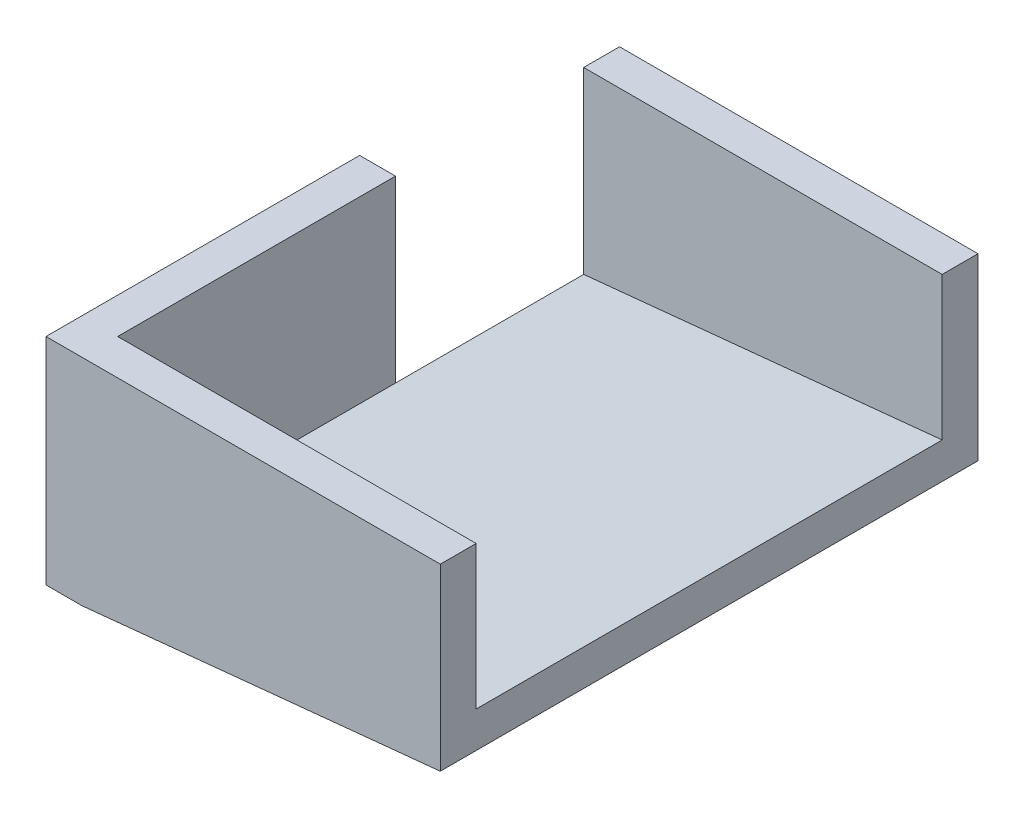
ISO-10303-21;
HEADER;
FILE_DESCRIPTION(('STEP AP214'),'2;1');
FILE_NAME('part.step','',(''),(''),'','','');
FILE_SCHEMA(('AUTOMOTIVE_DESIGN { 1 0 10303 214 1 1 1 1 }'));
ENDSEC;
DATA;
#1=APPLICATION_CONTEXT('core data for automotive mechanical design processes');
#2=APPLICATION_PROTOCOL_DEFINITION('international standard','automotive_design',2000,#1);
#3=PRODUCT_CONTEXT('',#1,'mechanical');
#4=PRODUCT('Part','Part','',(#3));
#5=PRODUCT_RELATED_PRODUCT_CATEGORY('part','',(#4));
#6=PRODUCT_DEFINITION_FORMATION('','',#4);
#7=PRODUCT_DEFINITION_CONTEXT('part definition',#1,'design');
#8=PRODUCT_DEFINITION('design','',#6,#7);
#9=PRODUCT_DEFINITION_SHAPE('','',#8);
#10=(LENGTH_UNIT() NAMED_UNIT(*) SI_UNIT(.MILLI.,.METRE.));
#11=(NAMED_UNIT(*) PLANE_ANGLE_UNIT() SI_UNIT($,.RADIAN.));
#12=(NAMED_UNIT(*) SI_UNIT($,.STERADIAN.) SOLID_ANGLE_UNIT());
#13=UNCERTAINTY_MEASURE_WITH_UNIT(LENGTH_MEASURE(1.E-05),#10,'distance_accuracy_value','');
#14=(GEOMETRIC_REPRESENTATION_CONTEXT(3) GLOBAL_UNCERTAINTY_ASSIGNED_CONTEXT((#13)) GLOBAL_UNIT_ASSIGNED_CONTEXT((#10,
#11,#12)) REPRESENTATION_CONTEXT('',''));
#15=CARTESIAN_POINT('',(0.,0.,0.));
#16=DIRECTION('',(0.,0.,1.));
#17=DIRECTION('',(1.,0.,0.));
#18=AXIS2_PLACEMENT_3D('',#15,#16,#17);
#19=CARTESIAN_POINT('',(-99.9999999999999,-10.,300.));
#20=DIRECTION('',(1.,0.,0.));
#21=DIRECTION('',(0.,0.,-1.));
#22=AXIS2_PLACEMENT_3D('',#19,#20,#21);
#23=PLANE('',#22);
#24=DIRECTION('',(0.,-1.,0.));
#25=VECTOR('',#24,1.);
#26=CARTESIAN_POINT('',(-99.9999999999999,-30.070032415397,125.));
#27=LINE('',#26,#25);
#28=CARTESIAN_POINT('',(-99.9999999999999,-10.,125.));
#29=VERTEX_POINT('',#28);
#30=CARTESIAN_POINT('',(-100.,-30.070032415397,125.));
#31=VERTEX_POINT('',#30);
#32=EDGE_CURVE('E139',#29,#31,#27,.T.);
#33=ORIENTED_EDGE('',*,*,#32,.F.);
#34=DIRECTION('',(0.,0.,-1.));
#35=VECTOR('',#34,1.);
#36=CARTESIAN_POINT('',(-99.9999999999999,-10.,300.));
#37=LINE('',#36,#35);
#38=CARTESIAN_POINT('',(-99.9999999999999,-10.,20.));
#39=VERTEX_POINT('',#38);
#40=EDGE_CURVE('E44',#29,#39,#37,.T.);
#41=ORIENTED_EDGE('',*,*,#40,.T.);
#42=DIRECTION('',(0.,-1.,0.));
#43=VECTOR('',#42,1.);
#44=CARTESIAN_POINT('',(-99.9999999999999,90.,20.));
#45=LINE('',#44,#43);
#46=CARTESIAN_POINT('',(-99.9999999999999,90.,20.));
#47=VERTEX_POINT('',#46);
#48=EDGE_CURVE('E194',#47,#39,#45,.T.);
#49=ORIENTED_EDGE('',*,*,#48,.F.);
#50=DIRECTION('',(0.,0.,1.));
#51=VECTOR('',#50,1.);
#52=CARTESIAN_POINT('',(-99.9999999999999,90.,20.));
#53=LINE('',#52,#51);
#54=CARTESIAN_POINT('',(-99.9999999999999,90.,0.));
#55=VERTEX_POINT('',#54);
#56=EDGE_CURVE('E180',#55,#47,#53,.T.);
#57=ORIENTED_EDGE('',*,*,#56,.F.);
#58=DIRECTION('',(0.,-1.,0.));
#59=VECTOR('',#58,1.);
#60=CARTESIAN_POINT('',(-99.9999999999999,-10.,0.));
#61=LINE('',#60,#59);
#62=CARTESIAN_POINT('',(-100.,-30.070032415397,0.));
#63=VERTEX_POINT('',#62);
#64=EDGE_CURVE('E200',#55,#63,#61,.T.);
#65=ORIENTED_EDGE('',*,*,#64,.T.);
#66=DIRECTION('',(0.,0.,-1.));
#67=VECTOR('',#66,1.);
#68=CARTESIAN_POINT('',(-100.,-30.070032415397,0.));
#69=LINE('',#68,#67);
#70=EDGE_CURVE('E159',#31,#63,#69,.T.);
#71=ORIENTED_EDGE('',*,*,#70,.F.);
#72=EDGE_LOOP('',(#33,#41,#49,#57,#65,#71));
#73=FACE_BOUND('',#72,.T.);
#74=ADVANCED_FACE('F36',(#73),#23,.F.);
#75=CARTESIAN_POINT('',(100.,90.,280.));
#76=DIRECTION('',(0.,0.,1.));
#77=DIRECTION('',(1.,0.,0.));
#78=AXIS2_PLACEMENT_3D('',#75,#76,#77);
#79=PLANE('',#78);
#80=DIRECTION('',(0.,-1.,0.));
#81=VECTOR('',#80,1.);
#82=CARTESIAN_POINT('',(-99.9999999999999,241.327459504216,280.));
#83=LINE('',#82,#81);
#84=CARTESIAN_POINT('',(-99.9999999999999,90.,280.));
#85=VERTEX_POINT('',#84);
#86=CARTESIAN_POINT('',(-99.9999999999999,-10.,280.));
#87=VERTEX_POINT('',#86);
#88=EDGE_CURVE('E147',#85,#87,#83,.T.);
#89=ORIENTED_EDGE('',*,*,#88,.F.);
#90=DIRECTION('',(-1.,0.,0.));
#91=VECTOR('',#90,1.);
#92=CARTESIAN_POINT('',(100.,90.,280.));
#93=LINE('',#92,#91);
#94=CARTESIAN_POINT('',(100.,90.,280.));
#95=VERTEX_POINT('',#94);
#96=EDGE_CURVE('E166',#95,#85,#93,.T.);
#97=ORIENTED_EDGE('',*,*,#96,.F.);
#98=DIRECTION('',(0.,-1.,0.));
#99=VECTOR('',#98,1.);
#100=CARTESIAN_POINT('',(100.,90.,280.));
#101=LINE('',#100,#99);
#102=CARTESIAN_POINT('',(100.,10.,280.));
#103=VERTEX_POINT('',#102);
#104=EDGE_CURVE('E174',#95,#103,#101,.T.);
#105=ORIENTED_EDGE('',*,*,#104,.T.);
#106=DIRECTION('',(-0.995037190209989,-0.0995037190209991,0.));
#107=VECTOR('',#106,1.);
#108=CARTESIAN_POINT('',(100.,10.,280.));
#109=LINE('',#108,#107);
#110=EDGE_CURVE('E177',#103,#87,#109,.T.);
#111=ORIENTED_EDGE('',*,*,#110,.T.);
#112=EDGE_LOOP('',(#89,#97,#105,#111));
#113=FACE_BOUND('',#112,.T.);
#114=ADVANCED_FACE('F237',(#113),#79,.F.);
#115=CARTESIAN_POINT('',(100.,10.,300.));
#116=DIRECTION('',(0.0995037190209991,-0.995037190209989,0.));
#117=DIRECTION('',(0.995037190209989,0.0995037190209991,0.));
#118=AXIS2_PLACEMENT_3D('',#115,#116,#117);
#119=PLANE('',#118);
#120=ORIENTED_EDGE('',*,*,#110,.F.);
#121=DIRECTION('',(0.,0.,-1.));
#122=VECTOR('',#121,1.);
#123=CARTESIAN_POINT('',(100.,10.,300.));
#124=LINE('',#123,#122);
#125=CARTESIAN_POINT('',(100.,10.,20.));
#126=VERTEX_POINT('',#125);
#127=EDGE_CURVE('E203',#103,#126,#124,.T.);
#128=ORIENTED_EDGE('',*,*,#127,.T.);
#129=DIRECTION('',(0.995037190209989,0.0995037190209991,0.));
#130=VECTOR('',#129,1.);
#131=CARTESIAN_POINT('',(99.9999999999999,10.,20.));
#132=LINE('',#131,#130);
#133=EDGE_CURVE('E197',#39,#126,#132,.T.);
#134=ORIENTED_EDGE('',*,*,#133,.F.);
#135=ORIENTED_EDGE('',*,*,#40,.F.);
#136=EDGE_CURVE('E11',#87,#29,#37,.T.);
#137=ORIENTED_EDGE('',*,*,#136,.F.);
#138=EDGE_LOOP('',(#120,#128,#134,#135,#137));
#139=FACE_BOUND('',#138,.T.);
#140=ADVANCED_FACE('F38',(#139),#119,.F.);
#141=CARTESIAN_POINT('',(100.,10.,300.));
#142=DIRECTION('',(-1.,0.,0.));
#143=DIRECTION('',(0.,0.,1.));
#144=AXIS2_PLACEMENT_3D('',#141,#142,#143);
#145=PLANE('',#144);
#146=DIRECTION('',(0.,1.,0.));
#147=VECTOR('',#146,1.);
#148=CARTESIAN_POINT('',(100.,10.,300.));
#149=LINE('',#148,#147);
#150=CARTESIAN_POINT('',(99.9999999999999,-10.0700324153969,300.));
#151=VERTEX_POINT('',#150);
#152=CARTESIAN_POINT('',(100.,90.,300.));
#153=VERTEX_POINT('',#152);
#154=EDGE_CURVE('E201',#151,#153,#149,.T.);
#155=ORIENTED_EDGE('',*,*,#154,.F.);
#156=DIRECTION('',(0.,0.,-1.));
#157=VECTOR('',#156,1.);
#158=CARTESIAN_POINT('',(100.,-10.0700324153969,300.));
#159=LINE('',#158,#157);
#160=CARTESIAN_POINT('',(100.,-10.0700324153969,0.));
#161=VERTEX_POINT('',#160);
#162=EDGE_CURVE('E156',#151,#161,#159,.T.);
#163=ORIENTED_EDGE('',*,*,#162,.T.);
#164=DIRECTION('',(0.,1.,0.));
#165=VECTOR('',#164,1.);
#166=CARTESIAN_POINT('',(100.,10.,0.));
#167=LINE('',#166,#165);
#168=CARTESIAN_POINT('',(100.,90.,0.));
#169=VERTEX_POINT('',#168);
#170=EDGE_CURVE('E204',#161,#169,#167,.T.);
#171=ORIENTED_EDGE('',*,*,#170,.T.);
#172=DIRECTION('',(0.,0.,-1.));
#173=VECTOR('',#172,1.);
#174=CARTESIAN_POINT('',(100.,90.,0.));
#175=LINE('',#174,#173);
#176=CARTESIAN_POINT('',(100.,90.,20.));
#177=VERTEX_POINT('',#176);
#178=EDGE_CURVE('E185',#177,#169,#175,.T.);
#179=ORIENTED_EDGE('',*,*,#178,.F.);
#180=DIRECTION('',(0.,-1.,0.));
#181=VECTOR('',#180,1.);
#182=CARTESIAN_POINT('',(100.,90.,20.));
#183=LINE('',#182,#181);
#184=EDGE_CURVE('E191',#177,#126,#183,.T.);
#185=ORIENTED_EDGE('',*,*,#184,.T.);
#186=ORIENTED_EDGE('',*,*,#127,.F.);
#187=ORIENTED_EDGE('',*,*,#104,.F.);
#188=DIRECTION('',(0.,0.,-1.));
#189=VECTOR('',#188,1.);
#190=CARTESIAN_POINT('',(100.,90.,300.));
#191=LINE('',#190,#189);
#192=EDGE_CURVE('E172',#153,#95,#191,.T.);
#193=ORIENTED_EDGE('',*,*,#192,.F.);
#194=EDGE_LOOP('',(#155,#163,#171,#179,#185,#186,#187,#193));
#195=FACE_BOUND('',#194,.T.);
#196=ADVANCED_FACE('F239',(#195),#145,.F.);
#197=CARTESIAN_POINT('',(0.,0.,300.));
#198=DIRECTION('',(0.,0.,1.));
#199=DIRECTION('',(1.,0.,0.));
#200=AXIS2_PLACEMENT_3D('',#197,#198,#199);
#201=PLANE('',#200);
#202=DIRECTION('',(-0.995037190209989,-0.0995037190209991,0.));
#203=VECTOR('',#202,1.);
#204=CARTESIAN_POINT('',(-98.6716253510696,-29.9371949505039,300.));
#205=LINE('',#204,#203);
#206=CARTESIAN_POINT('',(-100.,-30.070032415397,300.));
#207=VERTEX_POINT('',#206);
#208=EDGE_CURVE('E164',#151,#207,#205,.T.);
#209=ORIENTED_EDGE('',*,*,#208,.F.);
#210=ORIENTED_EDGE('',*,*,#154,.T.);
#211=DIRECTION('',(1.,0.,0.));
#212=VECTOR('',#211,1.);
#213=CARTESIAN_POINT('',(-99.9999999999999,90.,300.));
#214=LINE('',#213,#212);
#215=CARTESIAN_POINT('',(-120.,90.,300.));
#216=VERTEX_POINT('',#215);
#217=EDGE_CURVE('E169',#216,#153,#214,.T.);
#218=ORIENTED_EDGE('',*,*,#217,.F.);
#219=DIRECTION('',(0.,1.,0.));
#220=VECTOR('',#219,1.);
#221=CARTESIAN_POINT('',(-120.,0.,300.));
#222=LINE('',#221,#220);
#223=CARTESIAN_POINT('',(-120.,-30.070032415397,300.));
#224=VERTEX_POINT('',#223);
#225=EDGE_CURVE('E128',#224,#216,#222,.T.);
#226=ORIENTED_EDGE('',*,*,#225,.F.);
#227=DIRECTION('',(1.,0.,0.));
#228=VECTOR('',#227,1.);
#229=CARTESIAN_POINT('',(-120.,-30.070032415397,300.));
#230=LINE('',#229,#228);
#231=EDGE_CURVE('E123',#224,#207,#230,.T.);
#232=ORIENTED_EDGE('',*,*,#231,.T.);
#233=EDGE_LOOP('',(#209,#210,#218,#226,#232));
#234=FACE_BOUND('',#233,.T.);
#235=ADVANCED_FACE('F229',(#234),#201,.T.);
#236=CARTESIAN_POINT('',(0.,0.,0.));
#237=DIRECTION('',(0.,0.,1.));
#238=DIRECTION('',(1.,0.,0.));
#239=AXIS2_PLACEMENT_3D('',#236,#237,#238);
#240=PLANE('',#239);
#241=ORIENTED_EDGE('',*,*,#170,.F.);
#242=DIRECTION('',(0.995037190209989,0.0995037190209991,0.));
#243=VECTOR('',#242,1.);
#244=CARTESIAN_POINT('',(101.32837464893,-9.9371949505039,0.));
#245=LINE('',#244,#243);
#246=EDGE_CURVE('E161',#63,#161,#245,.T.);
#247=ORIENTED_EDGE('',*,*,#246,.F.);
#248=ORIENTED_EDGE('',*,*,#64,.F.);
#249=DIRECTION('',(-1.,0.,0.));
#250=VECTOR('',#249,1.);
#251=CARTESIAN_POINT('',(-99.9999999999999,90.,0.));
#252=LINE('',#251,#250);
#253=EDGE_CURVE('E188',#169,#55,#252,.T.);
#254=ORIENTED_EDGE('',*,*,#253,.F.);
#255=EDGE_LOOP('',(#241,#247,#248,#254));
#256=FACE_BOUND('',#255,.T.);
#257=ADVANCED_FACE('F223',(#256),#240,.F.);
#258=CARTESIAN_POINT('',(100.,90.,20.));
#259=DIRECTION('',(0.,0.,-1.));
#260=DIRECTION('',(-1.,0.,0.));
#261=AXIS2_PLACEMENT_3D('',#258,#259,#260);
#262=PLANE('',#261);
#263=ORIENTED_EDGE('',*,*,#48,.T.);
#264=ORIENTED_EDGE('',*,*,#133,.T.);
#265=ORIENTED_EDGE('',*,*,#184,.F.);
#266=DIRECTION('',(1.,0.,0.));
#267=VECTOR('',#266,1.);
#268=CARTESIAN_POINT('',(100.,90.,20.));
#269=LINE('',#268,#267);
#270=EDGE_CURVE('E183',#47,#177,#269,.T.);
#271=ORIENTED_EDGE('',*,*,#270,.F.);
#272=EDGE_LOOP('',(#263,#264,#265,#271));
#273=FACE_BOUND('',#272,.T.);
#274=ADVANCED_FACE('F216',(#273),#262,.F.);
#275=CARTESIAN_POINT('',(0.,90.,0.));
#276=DIRECTION('',(0.,-1.,0.));
#277=DIRECTION('',(0.,0.,-1.));
#278=AXIS2_PLACEMENT_3D('',#275,#276,#277);
#279=PLANE('',#278);
#280=ORIENTED_EDGE('',*,*,#56,.T.);
#281=ORIENTED_EDGE('',*,*,#270,.T.);
#282=ORIENTED_EDGE('',*,*,#178,.T.);
#283=ORIENTED_EDGE('',*,*,#253,.T.);
#284=EDGE_LOOP('',(#280,#281,#282,#283));
#285=FACE_BOUND('',#284,.T.);
#286=ADVANCED_FACE('F219',(#285),#279,.F.);
#287=CARTESIAN_POINT('',(0.,90.,0.));
#288=DIRECTION('',(0.,1.,0.));
#289=DIRECTION('',(0.,0.,1.));
#290=AXIS2_PLACEMENT_3D('',#287,#288,#289);
#291=PLANE('',#290);
#292=ORIENTED_EDGE('',*,*,#96,.T.);
#293=DIRECTION('',(0.,0.,-1.));
#294=VECTOR('',#293,1.);
#295=CARTESIAN_POINT('',(-99.9999999999999,90.,280.));
#296=LINE('',#295,#294);
#297=CARTESIAN_POINT('',(-99.9999999999999,90.,125.));
#298=VERTEX_POINT('',#297);
#299=EDGE_CURVE('E129',#85,#298,#296,.T.);
#300=ORIENTED_EDGE('',*,*,#299,.T.);
#301=DIRECTION('',(1.,0.,0.));
#302=VECTOR('',#301,1.);
#303=CARTESIAN_POINT('',(-99.9999999999999,90.,125.));
#304=LINE('',#303,#302);
#305=CARTESIAN_POINT('',(-120.,90.,125.));
#306=VERTEX_POINT('',#305);
#307=EDGE_CURVE('E145',#306,#298,#304,.T.);
#308=ORIENTED_EDGE('',*,*,#307,.F.);
#309=DIRECTION('',(0.,0.,-1.));
#310=VECTOR('',#309,1.);
#311=CARTESIAN_POINT('',(-120.,90.,0.));
#312=LINE('',#311,#310);
#313=EDGE_CURVE('E144',#216,#306,#312,.T.);
#314=ORIENTED_EDGE('',*,*,#313,.F.);
#315=ORIENTED_EDGE('',*,*,#217,.T.);
#316=ORIENTED_EDGE('',*,*,#192,.T.);
#317=EDGE_LOOP('',(#292,#300,#308,#314,#315,#316));
#318=FACE_BOUND('',#317,.T.);
#319=ADVANCED_FACE('F231',(#318),#291,.T.);
#320=CARTESIAN_POINT('',(1.98713192231653,-19.8713192231653,0.));
#321=DIRECTION('',(-0.0995037190209991,0.995037190209989,0.));
#322=DIRECTION('',(-0.995037190209989,-0.0995037190209991,0.));
#323=AXIS2_PLACEMENT_3D('',#320,#321,#322);
#324=PLANE('',#323);
#325=ORIENTED_EDGE('',*,*,#246,.T.);
#326=ORIENTED_EDGE('',*,*,#162,.F.);
#327=ORIENTED_EDGE('',*,*,#208,.T.);
#328=EDGE_CURVE('E57',#207,#31,#69,.T.);
#329=ORIENTED_EDGE('',*,*,#328,.T.);
#330=ORIENTED_EDGE('',*,*,#70,.T.);
#331=EDGE_LOOP('',(#325,#326,#327,#329,#330));
#332=FACE_BOUND('',#331,.T.);
#333=ADVANCED_FACE('F225',(#332),#324,.F.);
#334=CARTESIAN_POINT('',(-120.,-30.070032415397,0.));
#335=DIRECTION('',(0.,1.,0.));
#336=DIRECTION('',(0.,0.,1.));
#337=AXIS2_PLACEMENT_3D('',#334,#335,#336);
#338=PLANE('',#337);
#339=ORIENTED_EDGE('',*,*,#328,.F.);
#340=ORIENTED_EDGE('',*,*,#231,.F.);
#341=DIRECTION('',(0.,0.,1.));
#342=VECTOR('',#341,1.);
#343=CARTESIAN_POINT('',(-120.,-30.070032415397,0.));
#344=LINE('',#343,#342);
#345=CARTESIAN_POINT('',(-120.,-30.070032415397,125.));
#346=VERTEX_POINT('',#345);
#347=EDGE_CURVE('E118',#346,#224,#344,.T.);
#348=ORIENTED_EDGE('',*,*,#347,.F.);
#349=DIRECTION('',(-1.,0.,0.));
#350=VECTOR('',#349,1.);
#351=CARTESIAN_POINT('',(-120.,-30.070032415397,125.));
#352=LINE('',#351,#350);
#353=EDGE_CURVE('E121',#31,#346,#352,.T.);
#354=ORIENTED_EDGE('',*,*,#353,.F.);
#355=EDGE_LOOP('',(#339,#340,#348,#354));
#356=FACE_BOUND('',#355,.T.);
#357=ADVANCED_FACE('F120',(#356),#338,.F.);
#358=CARTESIAN_POINT('',(-120.,0.,0.));
#359=DIRECTION('',(-1.,0.,0.));
#360=DIRECTION('',(0.,0.,1.));
#361=AXIS2_PLACEMENT_3D('',#358,#359,#360);
#362=PLANE('',#361);
#363=ORIENTED_EDGE('',*,*,#313,.T.);
#364=DIRECTION('',(0.,1.,0.));
#365=VECTOR('',#364,1.);
#366=CARTESIAN_POINT('',(-120.,90.,125.));
#367=LINE('',#366,#365);
#368=EDGE_CURVE('E137',#346,#306,#367,.T.);
#369=ORIENTED_EDGE('',*,*,#368,.F.);
#370=ORIENTED_EDGE('',*,*,#347,.T.);
#371=ORIENTED_EDGE('',*,*,#225,.T.);
#372=EDGE_LOOP('',(#363,#369,#370,#371));
#373=FACE_BOUND('',#372,.T.);
#374=ADVANCED_FACE('F142',(#373),#362,.T.);
#375=CARTESIAN_POINT('',(-99.9999999999999,241.327459504216,280.));
#376=DIRECTION('',(-1.,0.,0.));
#377=DIRECTION('',(0.,0.,1.));
#378=AXIS2_PLACEMENT_3D('',#375,#376,#377);
#379=PLANE('',#378);
#380=ORIENTED_EDGE('',*,*,#299,.F.);
#381=ORIENTED_EDGE('',*,*,#88,.T.);
#382=ORIENTED_EDGE('',*,*,#136,.T.);
#383=EDGE_CURVE('E140',#298,#29,#27,.T.);
#384=ORIENTED_EDGE('',*,*,#383,.F.);
#385=EDGE_LOOP('',(#380,#381,#382,#384));
#386=FACE_BOUND('',#385,.T.);
#387=ADVANCED_FACE('F233',(#386),#379,.F.);
#388=CARTESIAN_POINT('',(0.,0.,125.));
#389=DIRECTION('',(0.,0.,1.));
#390=DIRECTION('',(1.,0.,0.));
#391=AXIS2_PLACEMENT_3D('',#388,#389,#390);
#392=PLANE('',#391);
#393=ORIENTED_EDGE('',*,*,#383,.T.);
#394=ORIENTED_EDGE('',*,*,#32,.T.);
#395=ORIENTED_EDGE('',*,*,#353,.T.);
#396=ORIENTED_EDGE('',*,*,#368,.T.);
#397=ORIENTED_EDGE('',*,*,#307,.T.);
#398=EDGE_LOOP('',(#393,#394,#395,#396,#397));
#399=FACE_BOUND('',#398,.T.);
#400=ADVANCED_FACE('F135',(#399),#392,.F.);
#401=CLOSED_SHELL('',(#74,#114,#140,#196,#235,#257,#274,#286,#319,#333,#357,#374,#387,#400));
#402=MANIFOLD_SOLID_BREP('B2',#401);
#403=ADVANCED_BREP_SHAPE_REPRESENTATION('',(#18,#402),#14);
#404=SHAPE_DEFINITION_REPRESENTATION(#9,#403);
ENDSEC;
END-ISO-10303-21;
